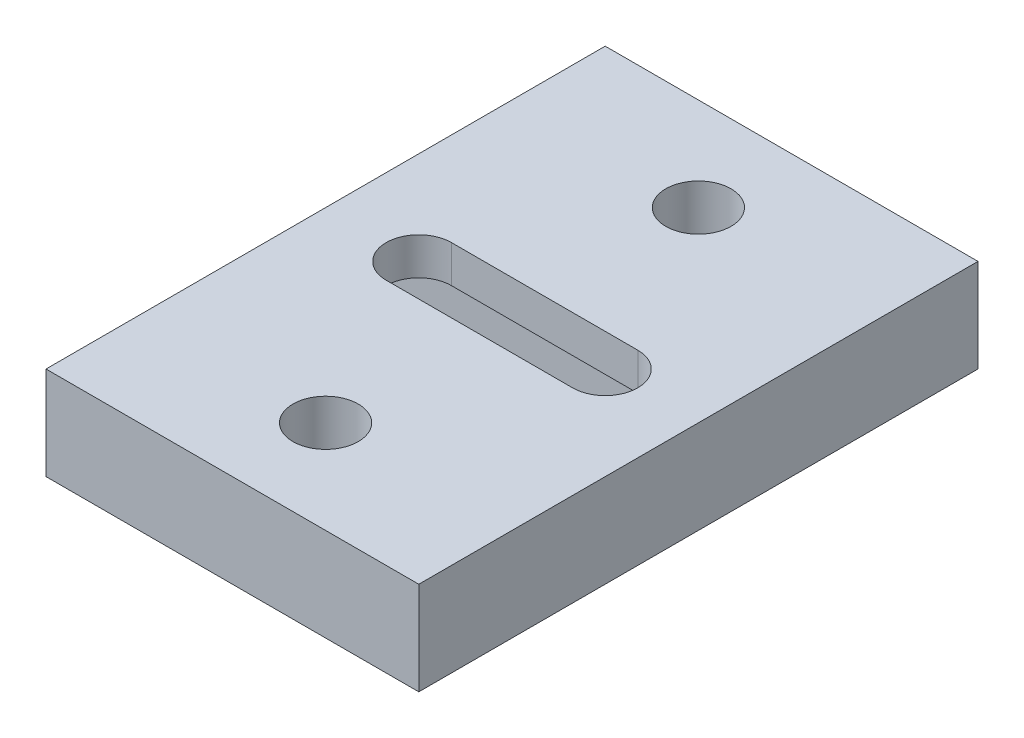
ISO-10303-21;
HEADER;
FILE_DESCRIPTION(('STEP AP214'),'2;1');
FILE_NAME('part.step','',(''),(''),'','','');
FILE_SCHEMA(('AUTOMOTIVE_DESIGN { 1 0 10303 214 1 1 1 1 }'));
ENDSEC;
DATA;
#1=APPLICATION_CONTEXT('core data for automotive mechanical design processes');
#2=APPLICATION_PROTOCOL_DEFINITION('international standard','automotive_design',2000,#1);
#3=PRODUCT_CONTEXT('',#1,'mechanical');
#4=PRODUCT('Part','Part','',(#3));
#5=PRODUCT_RELATED_PRODUCT_CATEGORY('part','',(#4));
#6=PRODUCT_DEFINITION_FORMATION('','',#4);
#7=PRODUCT_DEFINITION_CONTEXT('part definition',#1,'design');
#8=PRODUCT_DEFINITION('design','',#6,#7);
#9=PRODUCT_DEFINITION_SHAPE('','',#8);
#10=(LENGTH_UNIT() NAMED_UNIT(*) SI_UNIT(.MILLI.,.METRE.));
#11=(NAMED_UNIT(*) PLANE_ANGLE_UNIT() SI_UNIT($,.RADIAN.));
#12=(NAMED_UNIT(*) SI_UNIT($,.STERADIAN.) SOLID_ANGLE_UNIT());
#13=UNCERTAINTY_MEASURE_WITH_UNIT(LENGTH_MEASURE(1.E-05),#10,'distance_accuracy_value','');
#14=(GEOMETRIC_REPRESENTATION_CONTEXT(3) GLOBAL_UNCERTAINTY_ASSIGNED_CONTEXT((#13)) GLOBAL_UNIT_ASSIGNED_CONTEXT((#10,
#11,#12)) REPRESENTATION_CONTEXT('',''));
#15=CARTESIAN_POINT('',(0.,0.,0.));
#16=DIRECTION('',(0.,0.,1.));
#17=DIRECTION('',(1.,0.,0.));
#18=AXIS2_PLACEMENT_3D('',#15,#16,#17);
#19=CARTESIAN_POINT('',(0.,5.,0.));
#20=DIRECTION('',(1.,0.,0.));
#21=DIRECTION('',(0.,0.,-1.));
#22=AXIS2_PLACEMENT_3D('',#19,#20,#21);
#23=PLANE('',#22);
#24=DIRECTION('',(0.,0.,1.));
#25=VECTOR('',#24,1.);
#26=CARTESIAN_POINT('',(0.,0.,0.));
#27=LINE('',#26,#25);
#28=CARTESIAN_POINT('',(0.,0.,-30.));
#29=VERTEX_POINT('',#28);
#30=CARTESIAN_POINT('',(0.,0.,-18.));
#31=VERTEX_POINT('',#30);
#32=EDGE_CURVE('E230',#29,#31,#27,.T.);
#33=ORIENTED_EDGE('',*,*,#32,.T.);
#34=DIRECTION('',(0.,-1.,0.));
#35=VECTOR('',#34,1.);
#36=CARTESIAN_POINT('',(0.,0.,-18.));
#37=LINE('',#36,#35);
#38=CARTESIAN_POINT('',(0.,3.,-18.));
#39=VERTEX_POINT('',#38);
#40=EDGE_CURVE('E417',#39,#31,#37,.T.);
#41=ORIENTED_EDGE('',*,*,#40,.F.);
#42=DIRECTION('',(0.,0.,-1.));
#43=VECTOR('',#42,1.);
#44=CARTESIAN_POINT('',(0.,3.,-18.));
#45=LINE('',#44,#43);
#46=CARTESIAN_POINT('',(0.,3.,-12.3));
#47=VERTEX_POINT('',#46);
#48=EDGE_CURVE('E422',#47,#39,#45,.T.);
#49=ORIENTED_EDGE('',*,*,#48,.F.);
#50=DIRECTION('',(0.,1.,0.));
#51=VECTOR('',#50,1.);
#52=CARTESIAN_POINT('',(0.,0.,-12.3));
#53=LINE('',#52,#51);
#54=CARTESIAN_POINT('',(0.,0.,-12.3));
#55=VERTEX_POINT('',#54);
#56=EDGE_CURVE('E261',#55,#47,#53,.T.);
#57=ORIENTED_EDGE('',*,*,#56,.F.);
#58=CARTESIAN_POINT('',(0.,0.,0.));
#59=VERTEX_POINT('',#58);
#60=EDGE_CURVE('E150',#55,#59,#27,.T.);
#61=ORIENTED_EDGE('',*,*,#60,.T.);
#62=DIRECTION('',(0.,-1.,0.));
#63=VECTOR('',#62,1.);
#64=CARTESIAN_POINT('',(0.,5.,0.));
#65=LINE('',#64,#63);
#66=CARTESIAN_POINT('',(0.,5.,0.));
#67=VERTEX_POINT('',#66);
#68=EDGE_CURVE('E47',#67,#59,#65,.T.);
#69=ORIENTED_EDGE('',*,*,#68,.F.);
#70=DIRECTION('',(0.,0.,1.));
#71=VECTOR('',#70,1.);
#72=CARTESIAN_POINT('',(0.,5.,0.));
#73=LINE('',#72,#71);
#74=CARTESIAN_POINT('',(0.,5.,-30.));
#75=VERTEX_POINT('',#74);
#76=EDGE_CURVE('E215',#75,#67,#73,.T.);
#77=ORIENTED_EDGE('',*,*,#76,.F.);
#78=DIRECTION('',(0.,-1.,0.));
#79=VECTOR('',#78,1.);
#80=CARTESIAN_POINT('',(0.,5.,-30.));
#81=LINE('',#80,#79);
#82=EDGE_CURVE('E229',#75,#29,#81,.T.);
#83=ORIENTED_EDGE('',*,*,#82,.T.);
#84=EDGE_LOOP('',(#33,#41,#49,#57,#61,#69,#77,#83));
#85=FACE_BOUND('',#84,.T.);
#86=ADVANCED_FACE('F39',(#85),#23,.F.);
#87=CARTESIAN_POINT('',(0.,5.,0.));
#88=DIRECTION('',(0.,0.,-1.));
#89=DIRECTION('',(-1.,0.,0.));
#90=AXIS2_PLACEMENT_3D('',#87,#88,#89);
#91=PLANE('',#90);
#92=DIRECTION('',(1.,0.,0.));
#93=VECTOR('',#92,1.);
#94=CARTESIAN_POINT('',(0.,0.,0.));
#95=LINE('',#94,#93);
#96=CARTESIAN_POINT('',(20.,0.,0.));
#97=VERTEX_POINT('',#96);
#98=EDGE_CURVE('E234',#59,#97,#95,.T.);
#99=ORIENTED_EDGE('',*,*,#98,.T.);
#100=DIRECTION('',(0.,-1.,0.));
#101=VECTOR('',#100,1.);
#102=CARTESIAN_POINT('',(20.,5.,0.));
#103=LINE('',#102,#101);
#104=CARTESIAN_POINT('',(20.,5.,0.));
#105=VERTEX_POINT('',#104);
#106=EDGE_CURVE('E249',#105,#97,#103,.T.);
#107=ORIENTED_EDGE('',*,*,#106,.F.);
#108=DIRECTION('',(1.,0.,0.));
#109=VECTOR('',#108,1.);
#110=CARTESIAN_POINT('',(0.,5.,0.));
#111=LINE('',#110,#109);
#112=EDGE_CURVE('E219',#67,#105,#111,.T.);
#113=ORIENTED_EDGE('',*,*,#112,.F.);
#114=ORIENTED_EDGE('',*,*,#68,.T.);
#115=EDGE_LOOP('',(#99,#107,#113,#114));
#116=FACE_BOUND('',#115,.T.);
#117=ADVANCED_FACE('F256',(#116),#91,.F.);
#118=CARTESIAN_POINT('',(20.,5.,0.));
#119=DIRECTION('',(-1.,0.,0.));
#120=DIRECTION('',(0.,0.,1.));
#121=AXIS2_PLACEMENT_3D('',#118,#119,#120);
#122=PLANE('',#121);
#123=DIRECTION('',(0.,0.,-1.));
#124=VECTOR('',#123,1.);
#125=CARTESIAN_POINT('',(20.,0.,0.));
#126=LINE('',#125,#124);
#127=CARTESIAN_POINT('',(20.,0.,-30.));
#128=VERTEX_POINT('',#127);
#129=EDGE_CURVE('E237',#97,#128,#126,.T.);
#130=ORIENTED_EDGE('',*,*,#129,.T.);
#131=DIRECTION('',(0.,-1.,0.));
#132=VECTOR('',#131,1.);
#133=CARTESIAN_POINT('',(20.,5.,-30.));
#134=LINE('',#133,#132);
#135=CARTESIAN_POINT('',(20.,5.,-30.));
#136=VERTEX_POINT('',#135);
#137=EDGE_CURVE('E245',#136,#128,#134,.T.);
#138=ORIENTED_EDGE('',*,*,#137,.F.);
#139=DIRECTION('',(0.,0.,-1.));
#140=VECTOR('',#139,1.);
#141=CARTESIAN_POINT('',(20.,5.,0.));
#142=LINE('',#141,#140);
#143=EDGE_CURVE('E223',#105,#136,#142,.T.);
#144=ORIENTED_EDGE('',*,*,#143,.F.);
#145=ORIENTED_EDGE('',*,*,#106,.T.);
#146=EDGE_LOOP('',(#130,#138,#144,#145));
#147=FACE_BOUND('',#146,.T.);
#148=ADVANCED_FACE('F268',(#147),#122,.F.);
#149=CARTESIAN_POINT('',(0.,5.,-30.));
#150=DIRECTION('',(0.,0.,1.));
#151=DIRECTION('',(1.,0.,0.));
#152=AXIS2_PLACEMENT_3D('',#149,#150,#151);
#153=PLANE('',#152);
#154=DIRECTION('',(-1.,0.,0.));
#155=VECTOR('',#154,1.);
#156=CARTESIAN_POINT('',(0.,0.,-30.));
#157=LINE('',#156,#155);
#158=EDGE_CURVE('E220',#128,#29,#157,.T.);
#159=ORIENTED_EDGE('',*,*,#158,.T.);
#160=ORIENTED_EDGE('',*,*,#82,.F.);
#161=DIRECTION('',(-1.,0.,0.));
#162=VECTOR('',#161,1.);
#163=CARTESIAN_POINT('',(0.,5.,-30.));
#164=LINE('',#163,#162);
#165=EDGE_CURVE('E226',#136,#75,#164,.T.);
#166=ORIENTED_EDGE('',*,*,#165,.F.);
#167=ORIENTED_EDGE('',*,*,#137,.T.);
#168=EDGE_LOOP('',(#159,#160,#166,#167));
#169=FACE_BOUND('',#168,.T.);
#170=ADVANCED_FACE('F272',(#169),#153,.F.);
#171=CARTESIAN_POINT('',(0.,5.,0.));
#172=DIRECTION('',(0.,-1.,0.));
#173=DIRECTION('',(0.,0.,-1.));
#174=AXIS2_PLACEMENT_3D('',#171,#172,#173);
#175=PLANE('',#174);
#176=CARTESIAN_POINT('',(10.,5.,-25.));
#177=DIRECTION('',(0.,1.,0.));
#178=DIRECTION('',(0.,0.,1.));
#179=AXIS2_PLACEMENT_3D('',#176,#177,#178);
#180=CIRCLE('',#179,1.75);
#181=CARTESIAN_POINT('',(10.,5.,-23.25));
#182=VERTEX_POINT('',#181);
#183=EDGE_CURVE('E177',#182,#182,#180,.T.);
#184=ORIENTED_EDGE('',*,*,#183,.F.);
#185=EDGE_LOOP('',(#184));
#186=FACE_BOUND('',#185,.T.);
#187=CARTESIAN_POINT('',(10.,5.,-5.));
#188=DIRECTION('',(0.,1.,0.));
#189=DIRECTION('',(0.,0.,1.));
#190=AXIS2_PLACEMENT_3D('',#187,#188,#189);
#191=CIRCLE('',#190,1.75);
#192=CARTESIAN_POINT('',(10.,5.,-3.25));
#193=VERTEX_POINT('',#192);
#194=EDGE_CURVE('E171',#193,#193,#191,.T.);
#195=ORIENTED_EDGE('',*,*,#194,.F.);
#196=EDGE_LOOP('',(#195));
#197=FACE_BOUND('',#196,.T.);
#198=DIRECTION('',(1.,0.,0.));
#199=VECTOR('',#198,1.);
#200=CARTESIAN_POINT('',(5.,5.,-13.25));
#201=LINE('',#200,#199);
#202=CARTESIAN_POINT('',(5.,5.,-13.25));
#203=VERTEX_POINT('',#202);
#204=CARTESIAN_POINT('',(15.,5.,-13.25));
#205=VERTEX_POINT('',#204);
#206=EDGE_CURVE('E191',#203,#205,#201,.T.);
#207=ORIENTED_EDGE('',*,*,#206,.F.);
#208=CARTESIAN_POINT('',(5.,5.,-15.));
#209=DIRECTION('',(0.,1.,0.));
#210=DIRECTION('',(0.,0.,-1.));
#211=AXIS2_PLACEMENT_3D('',#208,#209,#210);
#212=CIRCLE('',#211,1.75);
#213=CARTESIAN_POINT('',(5.,5.,-16.75));
#214=VERTEX_POINT('',#213);
#215=EDGE_CURVE('E176',#214,#203,#212,.T.);
#216=ORIENTED_EDGE('',*,*,#215,.F.);
#217=DIRECTION('',(-1.,0.,0.));
#218=VECTOR('',#217,1.);
#219=CARTESIAN_POINT('',(5.,5.,-16.75));
#220=LINE('',#219,#218);
#221=CARTESIAN_POINT('',(15.,5.,-16.75));
#222=VERTEX_POINT('',#221);
#223=EDGE_CURVE('E199',#222,#214,#220,.T.);
#224=ORIENTED_EDGE('',*,*,#223,.F.);
#225=CARTESIAN_POINT('',(15.,5.,-15.));
#226=DIRECTION('',(0.,1.,0.));
#227=DIRECTION('',(0.,0.,-1.));
#228=AXIS2_PLACEMENT_3D('',#225,#226,#227);
#229=CIRCLE('',#228,1.75);
#230=EDGE_CURVE('E195',#205,#222,#229,.T.);
#231=ORIENTED_EDGE('',*,*,#230,.F.);
#232=EDGE_LOOP('',(#207,#216,#224,#231));
#233=FACE_BOUND('',#232,.T.);
#234=ORIENTED_EDGE('',*,*,#76,.T.);
#235=ORIENTED_EDGE('',*,*,#112,.T.);
#236=ORIENTED_EDGE('',*,*,#143,.T.);
#237=ORIENTED_EDGE('',*,*,#165,.T.);
#238=EDGE_LOOP('',(#234,#235,#236,#237));
#239=FACE_BOUND('',#238,.T.);
#240=ADVANCED_FACE('F275',(#186,#197,#233,#239),#175,.F.);
#241=CARTESIAN_POINT('',(0.,0.,0.));
#242=DIRECTION('',(0.,-1.,0.));
#243=DIRECTION('',(0.,0.,-1.));
#244=AXIS2_PLACEMENT_3D('',#241,#242,#243);
#245=PLANE('',#244);
#246=DIRECTION('',(-1.,0.,0.));
#247=VECTOR('',#246,1.);
#248=CARTESIAN_POINT('',(18.,0.,-18.));
#249=LINE('',#248,#247);
#250=CARTESIAN_POINT('',(18.,0.,-18.));
#251=VERTEX_POINT('',#250);
#252=EDGE_CURVE('E152',#251,#31,#249,.T.);
#253=ORIENTED_EDGE('',*,*,#252,.T.);
#254=ORIENTED_EDGE('',*,*,#32,.F.);
#255=ORIENTED_EDGE('',*,*,#158,.F.);
#256=ORIENTED_EDGE('',*,*,#129,.F.);
#257=ORIENTED_EDGE('',*,*,#98,.F.);
#258=ORIENTED_EDGE('',*,*,#60,.F.);
#259=DIRECTION('',(-1.,0.,0.));
#260=VECTOR('',#259,1.);
#261=CARTESIAN_POINT('',(18.,0.,-12.3));
#262=LINE('',#261,#260);
#263=CARTESIAN_POINT('',(18.,0.,-12.3));
#264=VERTEX_POINT('',#263);
#265=EDGE_CURVE('E132',#264,#55,#262,.T.);
#266=ORIENTED_EDGE('',*,*,#265,.F.);
#267=DIRECTION('',(0.,0.,1.));
#268=VECTOR('',#267,1.);
#269=CARTESIAN_POINT('',(18.,0.,-18.));
#270=LINE('',#269,#268);
#271=EDGE_CURVE('E138',#251,#264,#270,.T.);
#272=ORIENTED_EDGE('',*,*,#271,.F.);
#273=EDGE_LOOP('',(#253,#254,#255,#256,#257,#258,#266,#272));
#274=FACE_BOUND('',#273,.T.);
#275=CARTESIAN_POINT('',(10.,0.,-25.));
#276=DIRECTION('',(0.,1.,0.));
#277=DIRECTION('',(0.,0.,1.));
#278=AXIS2_PLACEMENT_3D('',#275,#276,#277);
#279=CIRCLE('',#278,1.75);
#280=CARTESIAN_POINT('',(10.,0.,-23.25));
#281=VERTEX_POINT('',#280);
#282=EDGE_CURVE('E172',#281,#281,#279,.T.);
#283=ORIENTED_EDGE('',*,*,#282,.T.);
#284=EDGE_LOOP('',(#283));
#285=FACE_BOUND('',#284,.T.);
#286=CARTESIAN_POINT('',(10.,0.,-5.));
#287=DIRECTION('',(0.,1.,0.));
#288=DIRECTION('',(0.,0.,1.));
#289=AXIS2_PLACEMENT_3D('',#286,#287,#288);
#290=CIRCLE('',#289,1.75);
#291=CARTESIAN_POINT('',(10.,0.,-3.25));
#292=VERTEX_POINT('',#291);
#293=EDGE_CURVE('E181',#292,#292,#290,.T.);
#294=ORIENTED_EDGE('',*,*,#293,.T.);
#295=EDGE_LOOP('',(#294));
#296=FACE_BOUND('',#295,.T.);
#297=ADVANCED_FACE('F147',(#274,#285,#296),#245,.T.);
#298=CARTESIAN_POINT('',(5.,-3.,-15.));
#299=DIRECTION('',(0.,1.,0.));
#300=DIRECTION('',(0.,0.,1.));
#301=AXIS2_PLACEMENT_3D('',#298,#299,#300);
#302=CYLINDRICAL_SURFACE('',#301,1.75);
#303=DIRECTION('',(0.,1.,0.));
#304=VECTOR('',#303,1.);
#305=CARTESIAN_POINT('',(5.,-3.,-13.25));
#306=LINE('',#305,#304);
#307=CARTESIAN_POINT('',(5.,3.,-13.25));
#308=VERTEX_POINT('',#307);
#309=EDGE_CURVE('E203',#308,#203,#306,.T.);
#310=ORIENTED_EDGE('',*,*,#309,.F.);
#311=CARTESIAN_POINT('',(5.,3.,-15.));
#312=DIRECTION('',(0.,1.,0.));
#313=DIRECTION('',(0.,0.,1.));
#314=AXIS2_PLACEMENT_3D('',#311,#312,#313);
#315=CIRCLE('',#314,1.75);
#316=CARTESIAN_POINT('',(5.,3.,-16.75));
#317=VERTEX_POINT('',#316);
#318=EDGE_CURVE('E62',#308,#317,#315,.F.);
#319=ORIENTED_EDGE('',*,*,#318,.T.);
#320=DIRECTION('',(0.,1.,0.));
#321=VECTOR('',#320,1.);
#322=CARTESIAN_POINT('',(5.,-3.,-16.75));
#323=LINE('',#322,#321);
#324=EDGE_CURVE('E204',#317,#214,#323,.T.);
#325=ORIENTED_EDGE('',*,*,#324,.T.);
#326=ORIENTED_EDGE('',*,*,#215,.T.);
#327=EDGE_LOOP('',(#310,#319,#325,#326));
#328=FACE_BOUND('',#327,.T.);
#329=ADVANCED_FACE('F283',(#328),#302,.F.);
#330=CARTESIAN_POINT('',(5.,-3.,-16.75));
#331=DIRECTION('',(0.,0.,-1.));
#332=DIRECTION('',(-1.,0.,0.));
#333=AXIS2_PLACEMENT_3D('',#330,#331,#332);
#334=PLANE('',#333);
#335=ORIENTED_EDGE('',*,*,#324,.F.);
#336=DIRECTION('',(1.,0.,0.));
#337=VECTOR('',#336,1.);
#338=CARTESIAN_POINT('',(5.,3.,-16.75));
#339=LINE('',#338,#337);
#340=CARTESIAN_POINT('',(15.,3.,-16.75));
#341=VERTEX_POINT('',#340);
#342=EDGE_CURVE('E165',#317,#341,#339,.T.);
#343=ORIENTED_EDGE('',*,*,#342,.T.);
#344=DIRECTION('',(0.,1.,0.));
#345=VECTOR('',#344,1.);
#346=CARTESIAN_POINT('',(15.,-3.,-16.75));
#347=LINE('',#346,#345);
#348=EDGE_CURVE('E207',#341,#222,#347,.T.);
#349=ORIENTED_EDGE('',*,*,#348,.T.);
#350=ORIENTED_EDGE('',*,*,#223,.T.);
#351=EDGE_LOOP('',(#335,#343,#349,#350));
#352=FACE_BOUND('',#351,.T.);
#353=ADVANCED_FACE('F353',(#352),#334,.F.);
#354=CARTESIAN_POINT('',(15.,-3.,-15.));
#355=DIRECTION('',(0.,1.,0.));
#356=DIRECTION('',(0.,0.,1.));
#357=AXIS2_PLACEMENT_3D('',#354,#355,#356);
#358=CYLINDRICAL_SURFACE('',#357,1.75);
#359=ORIENTED_EDGE('',*,*,#348,.F.);
#360=CARTESIAN_POINT('',(15.,3.,-15.));
#361=DIRECTION('',(0.,1.,0.));
#362=DIRECTION('',(0.,0.,1.));
#363=AXIS2_PLACEMENT_3D('',#360,#361,#362);
#364=CIRCLE('',#363,1.75);
#365=CARTESIAN_POINT('',(15.,3.,-13.25));
#366=VERTEX_POINT('',#365);
#367=EDGE_CURVE('E161',#341,#366,#364,.F.);
#368=ORIENTED_EDGE('',*,*,#367,.T.);
#369=DIRECTION('',(0.,1.,0.));
#370=VECTOR('',#369,1.);
#371=CARTESIAN_POINT('',(15.,-3.,-13.25));
#372=LINE('',#371,#370);
#373=EDGE_CURVE('E210',#366,#205,#372,.T.);
#374=ORIENTED_EDGE('',*,*,#373,.T.);
#375=ORIENTED_EDGE('',*,*,#230,.T.);
#376=EDGE_LOOP('',(#359,#368,#374,#375));
#377=FACE_BOUND('',#376,.T.);
#378=ADVANCED_FACE('F362',(#377),#358,.F.);
#379=CARTESIAN_POINT('',(5.,-3.,-13.25));
#380=DIRECTION('',(0.,0.,1.));
#381=DIRECTION('',(1.,0.,0.));
#382=AXIS2_PLACEMENT_3D('',#379,#380,#381);
#383=PLANE('',#382);
#384=ORIENTED_EDGE('',*,*,#373,.F.);
#385=DIRECTION('',(-1.,0.,0.));
#386=VECTOR('',#385,1.);
#387=CARTESIAN_POINT('',(5.,3.,-13.25));
#388=LINE('',#387,#386);
#389=EDGE_CURVE('E11',#366,#308,#388,.T.);
#390=ORIENTED_EDGE('',*,*,#389,.T.);
#391=ORIENTED_EDGE('',*,*,#309,.T.);
#392=ORIENTED_EDGE('',*,*,#206,.T.);
#393=EDGE_LOOP('',(#384,#390,#391,#392));
#394=FACE_BOUND('',#393,.T.);
#395=ADVANCED_FACE('F319',(#394),#383,.F.);
#396=CARTESIAN_POINT('',(10.,0.,-5.));
#397=DIRECTION('',(0.,1.,0.));
#398=DIRECTION('',(0.,0.,1.));
#399=AXIS2_PLACEMENT_3D('',#396,#397,#398);
#400=CYLINDRICAL_SURFACE('',#399,1.75);
#401=ORIENTED_EDGE('',*,*,#293,.F.);
#402=EDGE_LOOP('',(#401));
#403=FACE_BOUND('',#402,.T.);
#404=ORIENTED_EDGE('',*,*,#194,.T.);
#405=EDGE_LOOP('',(#404));
#406=FACE_BOUND('',#405,.T.);
#407=ADVANCED_FACE('F313',(#403,#406),#400,.F.);
#408=CARTESIAN_POINT('',(10.,0.,-25.));
#409=DIRECTION('',(0.,1.,0.));
#410=DIRECTION('',(0.,0.,1.));
#411=AXIS2_PLACEMENT_3D('',#408,#409,#410);
#412=CYLINDRICAL_SURFACE('',#411,1.75);
#413=ORIENTED_EDGE('',*,*,#282,.F.);
#414=EDGE_LOOP('',(#413));
#415=FACE_BOUND('',#414,.T.);
#416=ORIENTED_EDGE('',*,*,#183,.T.);
#417=EDGE_LOOP('',(#416));
#418=FACE_BOUND('',#417,.T.);
#419=ADVANCED_FACE('F318',(#415,#418),#412,.F.);
#420=CARTESIAN_POINT('',(18.,3.,-18.));
#421=DIRECTION('',(0.,1.,0.));
#422=DIRECTION('',(0.,0.,1.));
#423=AXIS2_PLACEMENT_3D('',#420,#421,#422);
#424=PLANE('',#423);
#425=ORIENTED_EDGE('',*,*,#48,.T.);
#426=DIRECTION('',(-1.,0.,0.));
#427=VECTOR('',#426,1.);
#428=CARTESIAN_POINT('',(18.,3.,-18.));
#429=LINE('',#428,#427);
#430=CARTESIAN_POINT('',(18.,3.,-18.));
#431=VERTEX_POINT('',#430);
#432=EDGE_CURVE('E156',#431,#39,#429,.T.);
#433=ORIENTED_EDGE('',*,*,#432,.F.);
#434=DIRECTION('',(0.,0.,-1.));
#435=VECTOR('',#434,1.);
#436=CARTESIAN_POINT('',(18.,3.,-18.));
#437=LINE('',#436,#435);
#438=CARTESIAN_POINT('',(18.,3.,-12.3));
#439=VERTEX_POINT('',#438);
#440=EDGE_CURVE('E137',#439,#431,#437,.T.);
#441=ORIENTED_EDGE('',*,*,#440,.F.);
#442=DIRECTION('',(-1.,0.,0.));
#443=VECTOR('',#442,1.);
#444=CARTESIAN_POINT('',(18.,3.,-12.3));
#445=LINE('',#444,#443);
#446=EDGE_CURVE('E134',#439,#47,#445,.T.);
#447=ORIENTED_EDGE('',*,*,#446,.T.);
#448=EDGE_LOOP('',(#425,#433,#441,#447));
#449=FACE_BOUND('',#448,.T.);
#450=ORIENTED_EDGE('',*,*,#389,.F.);
#451=ORIENTED_EDGE('',*,*,#367,.F.);
#452=ORIENTED_EDGE('',*,*,#342,.F.);
#453=ORIENTED_EDGE('',*,*,#318,.F.);
#454=EDGE_LOOP('',(#450,#451,#452,#453));
#455=FACE_BOUND('',#454,.T.);
#456=ADVANCED_FACE('F330',(#449,#455),#424,.F.);
#457=CARTESIAN_POINT('',(18.,0.,-18.));
#458=DIRECTION('',(0.,0.,-1.));
#459=DIRECTION('',(-1.,0.,0.));
#460=AXIS2_PLACEMENT_3D('',#457,#458,#459);
#461=PLANE('',#460);
#462=ORIENTED_EDGE('',*,*,#40,.T.);
#463=ORIENTED_EDGE('',*,*,#252,.F.);
#464=DIRECTION('',(0.,-1.,0.));
#465=VECTOR('',#464,1.);
#466=CARTESIAN_POINT('',(18.,0.,-18.));
#467=LINE('',#466,#465);
#468=EDGE_CURVE('E54',#431,#251,#467,.T.);
#469=ORIENTED_EDGE('',*,*,#468,.F.);
#470=ORIENTED_EDGE('',*,*,#432,.T.);
#471=EDGE_LOOP('',(#462,#463,#469,#470));
#472=FACE_BOUND('',#471,.T.);
#473=ADVANCED_FACE('F386',(#472),#461,.F.);
#474=CARTESIAN_POINT('',(18.,0.,-12.3));
#475=DIRECTION('',(0.,0.,1.));
#476=DIRECTION('',(1.,0.,0.));
#477=AXIS2_PLACEMENT_3D('',#474,#475,#476);
#478=PLANE('',#477);
#479=ORIENTED_EDGE('',*,*,#56,.T.);
#480=ORIENTED_EDGE('',*,*,#446,.F.);
#481=DIRECTION('',(0.,1.,0.));
#482=VECTOR('',#481,1.);
#483=CARTESIAN_POINT('',(18.,0.,-12.3));
#484=LINE('',#483,#482);
#485=EDGE_CURVE('E128',#264,#439,#484,.T.);
#486=ORIENTED_EDGE('',*,*,#485,.F.);
#487=ORIENTED_EDGE('',*,*,#265,.T.);
#488=EDGE_LOOP('',(#479,#480,#486,#487));
#489=FACE_BOUND('',#488,.T.);
#490=ADVANCED_FACE('F130',(#489),#478,.F.);
#491=CARTESIAN_POINT('',(18.,0.,0.));
#492=DIRECTION('',(1.,0.,0.));
#493=DIRECTION('',(0.,0.,-1.));
#494=AXIS2_PLACEMENT_3D('',#491,#492,#493);
#495=PLANE('',#494);
#496=ORIENTED_EDGE('',*,*,#468,.T.);
#497=ORIENTED_EDGE('',*,*,#271,.T.);
#498=ORIENTED_EDGE('',*,*,#485,.T.);
#499=ORIENTED_EDGE('',*,*,#440,.T.);
#500=EDGE_LOOP('',(#496,#497,#498,#499));
#501=FACE_BOUND('',#500,.T.);
#502=ADVANCED_FACE('F141',(#501),#495,.F.);
#503=CLOSED_SHELL('',(#86,#117,#148,#170,#240,#297,#329,#353,#378,#395,#407,#419,#456,#473,#490,#502));
#504=MANIFOLD_SOLID_BREP('B2',#503);
#505=ADVANCED_BREP_SHAPE_REPRESENTATION('',(#18,#504),#14);
#506=SHAPE_DEFINITION_REPRESENTATION(#9,#505);
ENDSEC;
END-ISO-10303-21;
